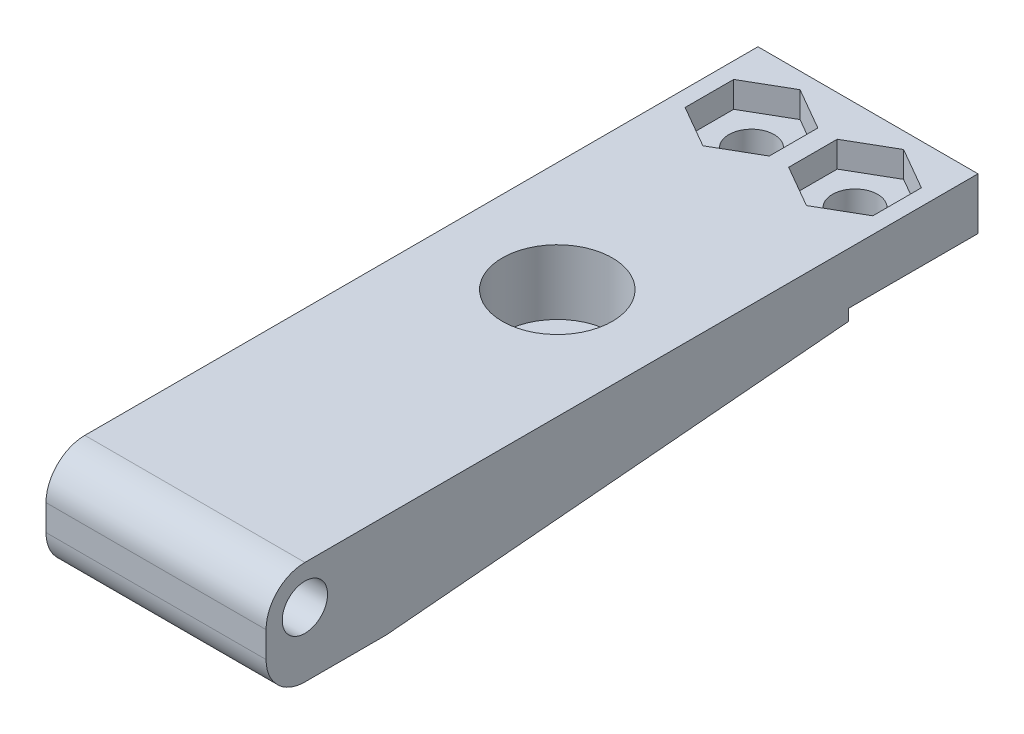
ISO-10303-21;
HEADER;
FILE_DESCRIPTION(('STEP AP214'),'2;1');
FILE_NAME('part.step','',(''),(''),'','','');
FILE_SCHEMA(('AUTOMOTIVE_DESIGN { 1 0 10303 214 1 1 1 1 }'));
ENDSEC;
DATA;
#1=APPLICATION_CONTEXT('core data for automotive mechanical design processes');
#2=APPLICATION_PROTOCOL_DEFINITION('international standard','automotive_design',2000,#1);
#3=PRODUCT_CONTEXT('',#1,'mechanical');
#4=PRODUCT('Part','Part','',(#3));
#5=PRODUCT_RELATED_PRODUCT_CATEGORY('part','',(#4));
#6=PRODUCT_DEFINITION_FORMATION('','',#4);
#7=PRODUCT_DEFINITION_CONTEXT('part definition',#1,'design');
#8=PRODUCT_DEFINITION('design','',#6,#7);
#9=PRODUCT_DEFINITION_SHAPE('','',#8);
#10=(LENGTH_UNIT() NAMED_UNIT(*) SI_UNIT(.MILLI.,.METRE.));
#11=(NAMED_UNIT(*) PLANE_ANGLE_UNIT() SI_UNIT($,.RADIAN.));
#12=(NAMED_UNIT(*) SI_UNIT($,.STERADIAN.) SOLID_ANGLE_UNIT());
#13=UNCERTAINTY_MEASURE_WITH_UNIT(LENGTH_MEASURE(1.E-05),#10,'distance_accuracy_value','');
#14=(GEOMETRIC_REPRESENTATION_CONTEXT(3) GLOBAL_UNCERTAINTY_ASSIGNED_CONTEXT((#13)) GLOBAL_UNIT_ASSIGNED_CONTEXT((#10,
#11,#12)) REPRESENTATION_CONTEXT('',''));
#15=CARTESIAN_POINT('',(0.,0.,0.));
#16=DIRECTION('',(0.,0.,1.));
#17=DIRECTION('',(1.,0.,0.));
#18=AXIS2_PLACEMENT_3D('',#15,#16,#17);
#19=CARTESIAN_POINT('',(4.,-5.,-47.));
#20=DIRECTION('',(0.,1.,0.));
#21=DIRECTION('',(0.,0.,1.));
#22=AXIS2_PLACEMENT_3D('',#19,#20,#21);
#23=CYLINDRICAL_SURFACE('',#22,1.75);
#24=CARTESIAN_POINT('',(4.,-1.,-47.));
#25=DIRECTION('',(0.,-1.,0.));
#26=DIRECTION('',(0.,0.,-1.));
#27=AXIS2_PLACEMENT_3D('',#24,#25,#26);
#28=CIRCLE('',#27,1.75);
#29=CARTESIAN_POINT('',(4.,-1.,-48.75));
#30=VERTEX_POINT('',#29);
#31=EDGE_CURVE('E237',#30,#30,#28,.T.);
#32=ORIENTED_EDGE('',*,*,#31,.T.);
#33=EDGE_LOOP('',(#32));
#34=FACE_BOUND('',#33,.T.);
#35=CARTESIAN_POINT('',(4.,1.,-47.));
#36=DIRECTION('',(0.,1.,0.));
#37=DIRECTION('',(0.,0.,1.));
#38=AXIS2_PLACEMENT_3D('',#35,#36,#37);
#39=CIRCLE('',#38,1.75);
#40=CARTESIAN_POINT('',(4.,1.,-45.25));
#41=VERTEX_POINT('',#40);
#42=EDGE_CURVE('E206',#41,#41,#39,.T.);
#43=ORIENTED_EDGE('',*,*,#42,.T.);
#44=EDGE_LOOP('',(#43));
#45=FACE_BOUND('',#44,.T.);
#46=ADVANCED_FACE('F41',(#34,#45),#23,.F.);
#47=CARTESIAN_POINT('',(-4.,-5.,-47.));
#48=DIRECTION('',(0.,1.,0.));
#49=DIRECTION('',(0.,0.,1.));
#50=AXIS2_PLACEMENT_3D('',#47,#48,#49);
#51=CYLINDRICAL_SURFACE('',#50,1.75);
#52=CARTESIAN_POINT('',(-4.,-1.,-47.));
#53=DIRECTION('',(0.,-1.,0.));
#54=DIRECTION('',(0.,0.,-1.));
#55=AXIS2_PLACEMENT_3D('',#52,#53,#54);
#56=CIRCLE('',#55,1.75);
#57=CARTESIAN_POINT('',(-4.,-1.,-48.75));
#58=VERTEX_POINT('',#57);
#59=EDGE_CURVE('E45',#58,#58,#56,.T.);
#60=ORIENTED_EDGE('',*,*,#59,.T.);
#61=EDGE_LOOP('',(#60));
#62=FACE_BOUND('',#61,.T.);
#63=CARTESIAN_POINT('',(-4.,1.,-47.));
#64=DIRECTION('',(0.,1.,0.));
#65=DIRECTION('',(0.,0.,1.));
#66=AXIS2_PLACEMENT_3D('',#63,#64,#65);
#67=CIRCLE('',#66,1.75);
#68=CARTESIAN_POINT('',(-4.,1.,-45.25));
#69=VERTEX_POINT('',#68);
#70=EDGE_CURVE('E245',#69,#69,#67,.T.);
#71=ORIENTED_EDGE('',*,*,#70,.T.);
#72=EDGE_LOOP('',(#71));
#73=FACE_BOUND('',#72,.T.);
#74=ADVANCED_FACE('F372',(#62,#73),#51,.F.);
#75=CARTESIAN_POINT('',(8.5,3.,0.));
#76=DIRECTION('',(0.,1.,0.));
#77=DIRECTION('',(0.,0.,1.));
#78=AXIS2_PLACEMENT_3D('',#75,#76,#77);
#79=PLANE('',#78);
#80=CARTESIAN_POINT('',(0.,3.,-28.));
#81=DIRECTION('',(0.,1.,0.));
#82=DIRECTION('',(0.,0.,1.));
#83=AXIS2_PLACEMENT_3D('',#80,#81,#82);
#84=CIRCLE('',#83,4.25);
#85=CARTESIAN_POINT('',(0.,3.,-23.75));
#86=VERTEX_POINT('',#85);
#87=EDGE_CURVE('E659',#86,#86,#84,.T.);
#88=ORIENTED_EDGE('',*,*,#87,.F.);
#89=EDGE_LOOP('',(#88));
#90=FACE_BOUND('',#89,.T.);
#91=DIRECTION('',(-0.86602540378444,0.,0.499999999999998));
#92=VECTOR('',#91,1.);
#93=CARTESIAN_POINT('',(-20.9765969889343,3.,-36.3325317547307));
#94=LINE('',#93,#92);
#95=CARTESIAN_POINT('',(4.00000000000001,3.,-50.7527767497326));
#96=VERTEX_POINT('',#95);
#97=CARTESIAN_POINT('',(0.749999999999983,3.,-48.8763883748663));
#98=VERTEX_POINT('',#97);
#99=EDGE_CURVE('E58',#96,#98,#94,.T.);
#100=ORIENTED_EDGE('',*,*,#99,.F.);
#101=DIRECTION('',(-0.866025403784438,0.,-0.5));
#102=VECTOR('',#101,1.);
#103=CARTESIAN_POINT('',(22.9765969889343,3.,-39.7966333698683));
#104=LINE('',#103,#102);
#105=CARTESIAN_POINT('',(7.25000000000001,3.,-48.8763883748663));
#106=VERTEX_POINT('',#105);
#107=EDGE_CURVE('E209',#106,#96,#104,.T.);
#108=ORIENTED_EDGE('',*,*,#107,.F.);
#109=DIRECTION('',(0.,0.,-1.));
#110=VECTOR('',#109,1.);
#111=CARTESIAN_POINT('',(7.25000000000001,3.,0.));
#112=LINE('',#111,#110);
#113=CARTESIAN_POINT('',(7.25000000000001,3.,-45.1236116251337));
#114=VERTEX_POINT('',#113);
#115=EDGE_CURVE('E230',#114,#106,#112,.T.);
#116=ORIENTED_EDGE('',*,*,#115,.F.);
#117=DIRECTION('',(0.866025403784439,0.,-0.5));
#118=VECTOR('',#117,1.);
#119=CARTESIAN_POINT('',(-17.7265969889343,3.,-30.7033666301317));
#120=LINE('',#119,#118);
#121=CARTESIAN_POINT('',(4.,3.,-43.2472232502674));
#122=VERTEX_POINT('',#121);
#123=EDGE_CURVE('E227',#122,#114,#120,.T.);
#124=ORIENTED_EDGE('',*,*,#123,.F.);
#125=DIRECTION('',(0.866025403784438,0.,0.500000000000001));
#126=VECTOR('',#125,1.);
#127=CARTESIAN_POINT('',(19.7265969889343,3.,-34.1674682452694));
#128=LINE('',#127,#126);
#129=CARTESIAN_POINT('',(0.749999999999983,3.,-45.1236116251337));
#130=VERTEX_POINT('',#129);
#131=EDGE_CURVE('E224',#130,#122,#128,.T.);
#132=ORIENTED_EDGE('',*,*,#131,.F.);
#133=DIRECTION('',(0.,0.,1.));
#134=VECTOR('',#133,1.);
#135=CARTESIAN_POINT('',(0.749999999999975,3.,0.));
#136=LINE('',#135,#134);
#137=EDGE_CURVE('E221',#98,#130,#136,.T.);
#138=ORIENTED_EDGE('',*,*,#137,.F.);
#139=EDGE_LOOP('',(#100,#108,#116,#124,#132,#138));
#140=FACE_BOUND('',#139,.T.);
#141=DIRECTION('',(0.866025403784438,0.,-0.500000000000001));
#142=VECTOR('',#141,1.);
#143=CARTESIAN_POINT('',(-19.7265969889343,3.,-34.1674682452694));
#144=LINE('',#143,#142);
#145=CARTESIAN_POINT('',(-4.,3.,-43.2472232502674));
#146=VERTEX_POINT('',#145);
#147=CARTESIAN_POINT('',(-0.749999999999994,3.,-45.1236116251337));
#148=VERTEX_POINT('',#147);
#149=EDGE_CURVE('E66',#146,#148,#144,.T.);
#150=ORIENTED_EDGE('',*,*,#149,.F.);
#151=DIRECTION('',(0.866025403784438,0.,0.5));
#152=VECTOR('',#151,1.);
#153=CARTESIAN_POINT('',(17.7265969889343,3.,-30.7033666301317));
#154=LINE('',#153,#152);
#155=CARTESIAN_POINT('',(-7.25000000000001,3.,-45.1236116251337));
#156=VERTEX_POINT('',#155);
#157=EDGE_CURVE('E249',#156,#146,#154,.T.);
#158=ORIENTED_EDGE('',*,*,#157,.F.);
#159=DIRECTION('',(0.,0.,1.));
#160=VECTOR('',#159,1.);
#161=CARTESIAN_POINT('',(-7.25000000000001,3.,0.));
#162=LINE('',#161,#160);
#163=CARTESIAN_POINT('',(-7.25000000000002,3.,-48.8763883748663));
#164=VERTEX_POINT('',#163);
#165=EDGE_CURVE('E279',#164,#156,#162,.T.);
#166=ORIENTED_EDGE('',*,*,#165,.F.);
#167=DIRECTION('',(-0.86602540378444,0.,0.499999999999998));
#168=VECTOR('',#167,1.);
#169=CARTESIAN_POINT('',(-22.9765969889342,3.,-39.7966333698684));
#170=LINE('',#169,#168);
#171=CARTESIAN_POINT('',(-4.,3.,-50.7527767497326));
#172=VERTEX_POINT('',#171);
#173=EDGE_CURVE('E276',#172,#164,#170,.T.);
#174=ORIENTED_EDGE('',*,*,#173,.F.);
#175=DIRECTION('',(-0.866025403784441,0.,-0.499999999999995));
#176=VECTOR('',#175,1.);
#177=CARTESIAN_POINT('',(20.9765969889342,3.,-36.3325317547308));
#178=LINE('',#177,#176);
#179=CARTESIAN_POINT('',(-0.749999999999994,3.,-48.8763883748663));
#180=VERTEX_POINT('',#179);
#181=EDGE_CURVE('E273',#180,#172,#178,.T.);
#182=ORIENTED_EDGE('',*,*,#181,.F.);
#183=DIRECTION('',(0.,0.,-1.));
#184=VECTOR('',#183,1.);
#185=CARTESIAN_POINT('',(-0.749999999999995,3.,0.));
#186=LINE('',#185,#184);
#187=EDGE_CURVE('E269',#148,#180,#186,.T.);
#188=ORIENTED_EDGE('',*,*,#187,.F.);
#189=EDGE_LOOP('',(#150,#158,#166,#174,#182,#188));
#190=FACE_BOUND('',#189,.T.);
#191=DIRECTION('',(0.,0.,-1.));
#192=VECTOR('',#191,1.);
#193=CARTESIAN_POINT('',(-8.5,3.,0.));
#194=LINE('',#193,#192);
#195=CARTESIAN_POINT('',(-8.5,3.,0.));
#196=VERTEX_POINT('',#195);
#197=CARTESIAN_POINT('',(-8.5,3.,-52.));
#198=VERTEX_POINT('',#197);
#199=EDGE_CURVE('E324',#196,#198,#194,.T.);
#200=ORIENTED_EDGE('',*,*,#199,.F.);
#201=DIRECTION('',(-1.,0.,0.));
#202=VECTOR('',#201,1.);
#203=CARTESIAN_POINT('',(8.5,3.,0.));
#204=LINE('',#203,#202);
#205=CARTESIAN_POINT('',(8.5,3.,0.));
#206=VERTEX_POINT('',#205);
#207=EDGE_CURVE('E359',#206,#196,#204,.T.);
#208=ORIENTED_EDGE('',*,*,#207,.F.);
#209=DIRECTION('',(0.,0.,-1.));
#210=VECTOR('',#209,1.);
#211=CARTESIAN_POINT('',(8.5,3.,0.));
#212=LINE('',#211,#210);
#213=CARTESIAN_POINT('',(8.5,3.,-52.));
#214=VERTEX_POINT('',#213);
#215=EDGE_CURVE('E297',#206,#214,#212,.T.);
#216=ORIENTED_EDGE('',*,*,#215,.T.);
#217=DIRECTION('',(-1.,0.,0.));
#218=VECTOR('',#217,1.);
#219=CARTESIAN_POINT('',(8.5,3.,-52.));
#220=LINE('',#219,#218);
#221=EDGE_CURVE('E320',#214,#198,#220,.T.);
#222=ORIENTED_EDGE('',*,*,#221,.T.);
#223=EDGE_LOOP('',(#200,#208,#216,#222));
#224=FACE_BOUND('',#223,.T.);
#225=ADVANCED_FACE('F419',(#90,#140,#190,#224),#79,.T.);
#226=CARTESIAN_POINT('',(8.5,0.,0.));
#227=DIRECTION('',(-1.,0.,0.));
#228=DIRECTION('',(0.,0.,1.));
#229=AXIS2_PLACEMENT_3D('',#226,#227,#228);
#230=CYLINDRICAL_SURFACE('',#229,3.);
#231=CARTESIAN_POINT('',(-8.5,0.,0.));
#232=DIRECTION('',(1.,0.,0.));
#233=DIRECTION('',(0.,0.,-1.));
#234=AXIS2_PLACEMENT_3D('',#231,#232,#233);
#235=CIRCLE('',#234,3.);
#236=CARTESIAN_POINT('',(-8.5,0.,3.));
#237=VERTEX_POINT('',#236);
#238=EDGE_CURVE('E327',#196,#237,#235,.T.);
#239=ORIENTED_EDGE('',*,*,#238,.T.);
#240=DIRECTION('',(-1.,0.,0.));
#241=VECTOR('',#240,1.);
#242=CARTESIAN_POINT('',(8.5,0.,3.));
#243=LINE('',#242,#241);
#244=CARTESIAN_POINT('',(8.5,0.,3.));
#245=VERTEX_POINT('',#244);
#246=EDGE_CURVE('E356',#245,#237,#243,.T.);
#247=ORIENTED_EDGE('',*,*,#246,.F.);
#248=CARTESIAN_POINT('',(8.5,0.,0.));
#249=DIRECTION('',(1.,0.,0.));
#250=DIRECTION('',(0.,0.,-1.));
#251=AXIS2_PLACEMENT_3D('',#248,#249,#250);
#252=CIRCLE('',#251,3.);
#253=EDGE_CURVE('E301',#206,#245,#252,.T.);
#254=ORIENTED_EDGE('',*,*,#253,.F.);
#255=ORIENTED_EDGE('',*,*,#207,.T.);
#256=EDGE_LOOP('',(#239,#247,#254,#255));
#257=FACE_BOUND('',#256,.T.);
#258=ADVANCED_FACE('F417',(#257),#230,.T.);
#259=CARTESIAN_POINT('',(8.5,0.,3.));
#260=DIRECTION('',(0.,0.,-1.));
#261=DIRECTION('',(0.,1.,0.));
#262=AXIS2_PLACEMENT_3D('',#259,#260,#261);
#263=PLANE('',#262);
#264=DIRECTION('',(0.,-1.,0.));
#265=VECTOR('',#264,1.);
#266=CARTESIAN_POINT('',(-8.5,0.,3.));
#267=LINE('',#266,#265);
#268=CARTESIAN_POINT('',(-8.5,-2.,3.));
#269=VERTEX_POINT('',#268);
#270=EDGE_CURVE('E330',#237,#269,#267,.T.);
#271=ORIENTED_EDGE('',*,*,#270,.T.);
#272=DIRECTION('',(-1.,0.,0.));
#273=VECTOR('',#272,1.);
#274=CARTESIAN_POINT('',(8.5,-2.,3.));
#275=LINE('',#274,#273);
#276=CARTESIAN_POINT('',(8.5,-2.,3.));
#277=VERTEX_POINT('',#276);
#278=EDGE_CURVE('E50',#269,#277,#275,.F.);
#279=ORIENTED_EDGE('',*,*,#278,.T.);
#280=DIRECTION('',(0.,-1.,0.));
#281=VECTOR('',#280,1.);
#282=CARTESIAN_POINT('',(8.5,0.,3.));
#283=LINE('',#282,#281);
#284=EDGE_CURVE('E304',#245,#277,#283,.T.);
#285=ORIENTED_EDGE('',*,*,#284,.F.);
#286=ORIENTED_EDGE('',*,*,#246,.T.);
#287=EDGE_LOOP('',(#271,#279,#285,#286));
#288=FACE_BOUND('',#287,.T.);
#289=ADVANCED_FACE('F413',(#288),#263,.F.);
#290=CARTESIAN_POINT('',(8.5,-5.,0.));
#291=DIRECTION('',(0.,1.,0.));
#292=DIRECTION('',(0.,0.,1.));
#293=AXIS2_PLACEMENT_3D('',#290,#291,#292);
#294=PLANE('',#293);
#295=DIRECTION('',(0.,0.,-1.));
#296=VECTOR('',#295,1.);
#297=CARTESIAN_POINT('',(8.5,-5.,0.));
#298=LINE('',#297,#296);
#299=CARTESIAN_POINT('',(8.5,-5.,0.));
#300=VERTEX_POINT('',#299);
#301=CARTESIAN_POINT('',(8.5,-5.,-6.27979078895471));
#302=VERTEX_POINT('',#301);
#303=EDGE_CURVE('E307',#300,#302,#298,.T.);
#304=ORIENTED_EDGE('',*,*,#303,.F.);
#305=DIRECTION('',(-1.,0.,0.));
#306=VECTOR('',#305,1.);
#307=CARTESIAN_POINT('',(8.5,-5.,0.));
#308=LINE('',#307,#306);
#309=CARTESIAN_POINT('',(-8.5,-5.,0.));
#310=VERTEX_POINT('',#309);
#311=EDGE_CURVE('E361',#300,#310,#308,.T.);
#312=ORIENTED_EDGE('',*,*,#311,.T.);
#313=DIRECTION('',(0.,0.,-1.));
#314=VECTOR('',#313,1.);
#315=CARTESIAN_POINT('',(-8.5,-5.,0.));
#316=LINE('',#315,#314);
#317=CARTESIAN_POINT('',(-8.5,-5.,-6.27979078895471));
#318=VERTEX_POINT('',#317);
#319=EDGE_CURVE('E333',#310,#318,#316,.T.);
#320=ORIENTED_EDGE('',*,*,#319,.T.);
#321=DIRECTION('',(-1.,0.,0.));
#322=VECTOR('',#321,1.);
#323=CARTESIAN_POINT('',(8.5,-5.,-6.27979078895471));
#324=LINE('',#323,#322);
#325=EDGE_CURVE('E353',#302,#318,#324,.T.);
#326=ORIENTED_EDGE('',*,*,#325,.F.);
#327=EDGE_LOOP('',(#304,#312,#320,#326));
#328=FACE_BOUND('',#327,.T.);
#329=ADVANCED_FACE('F407',(#328),#294,.F.);
#330=CARTESIAN_POINT('',(8.5,-5.5072564958463,-0.481822510516057));
#331=DIRECTION('',(0.,0.996194698091746,0.0871557427476583));
#332=DIRECTION('',(0.,-0.0871557427476583,0.996194698091746));
#333=AXIS2_PLACEMENT_3D('',#330,#331,#332);
#334=PLANE('',#333);
#335=DIRECTION('',(0.,0.0871557427476583,-0.996194698091746));
#336=VECTOR('',#335,1.);
#337=CARTESIAN_POINT('',(-8.5,-5.5072564958463,-0.481822510516057));
#338=LINE('',#337,#336);
#339=CARTESIAN_POINT('',(-8.5,-1.87488663525924,-42.));
#340=VERTEX_POINT('',#339);
#341=EDGE_CURVE('E335',#318,#340,#338,.T.);
#342=ORIENTED_EDGE('',*,*,#341,.T.);
#343=DIRECTION('',(-1.,0.,0.));
#344=VECTOR('',#343,1.);
#345=CARTESIAN_POINT('',(8.5,-1.87488663525924,-42.));
#346=LINE('',#345,#344);
#347=CARTESIAN_POINT('',(8.5,-1.87488663525924,-42.));
#348=VERTEX_POINT('',#347);
#349=EDGE_CURVE('E351',#348,#340,#346,.T.);
#350=ORIENTED_EDGE('',*,*,#349,.F.);
#351=DIRECTION('',(0.,0.0871557427476583,-0.996194698091746));
#352=VECTOR('',#351,1.);
#353=CARTESIAN_POINT('',(8.5,-5.5072564958463,-0.481822510516057));
#354=LINE('',#353,#352);
#355=EDGE_CURVE('E309',#302,#348,#354,.T.);
#356=ORIENTED_EDGE('',*,*,#355,.F.);
#357=ORIENTED_EDGE('',*,*,#325,.T.);
#358=EDGE_LOOP('',(#342,#350,#356,#357));
#359=FACE_BOUND('',#358,.T.);
#360=ADVANCED_FACE('F404',(#359),#334,.F.);
#361=CARTESIAN_POINT('',(8.5,0.,-42.));
#362=DIRECTION('',(0.,0.,-1.));
#363=DIRECTION('',(-1.,0.,0.));
#364=AXIS2_PLACEMENT_3D('',#361,#362,#363);
#365=PLANE('',#364);
#366=DIRECTION('',(0.,-1.,0.));
#367=VECTOR('',#366,1.);
#368=CARTESIAN_POINT('',(-8.5,0.,-42.));
#369=LINE('',#368,#367);
#370=CARTESIAN_POINT('',(-8.5,-1.,-42.));
#371=VERTEX_POINT('',#370);
#372=EDGE_CURVE('E338',#371,#340,#369,.T.);
#373=ORIENTED_EDGE('',*,*,#372,.F.);
#374=DIRECTION('',(-1.,0.,0.));
#375=VECTOR('',#374,1.);
#376=CARTESIAN_POINT('',(8.5,-1.,-42.));
#377=LINE('',#376,#375);
#378=CARTESIAN_POINT('',(8.5,-1.,-42.));
#379=VERTEX_POINT('',#378);
#380=EDGE_CURVE('E349',#379,#371,#377,.T.);
#381=ORIENTED_EDGE('',*,*,#380,.F.);
#382=DIRECTION('',(0.,-1.,0.));
#383=VECTOR('',#382,1.);
#384=CARTESIAN_POINT('',(8.5,0.,-42.));
#385=LINE('',#384,#383);
#386=EDGE_CURVE('E311',#379,#348,#385,.T.);
#387=ORIENTED_EDGE('',*,*,#386,.T.);
#388=ORIENTED_EDGE('',*,*,#349,.T.);
#389=EDGE_LOOP('',(#373,#381,#387,#388));
#390=FACE_BOUND('',#389,.T.);
#391=ADVANCED_FACE('F379',(#390),#365,.T.);
#392=CARTESIAN_POINT('',(8.5,-1.00000000000001,0.));
#393=DIRECTION('',(0.,-1.,0.));
#394=DIRECTION('',(0.,0.,-1.));
#395=AXIS2_PLACEMENT_3D('',#392,#393,#394);
#396=PLANE('',#395);
#397=ORIENTED_EDGE('',*,*,#59,.F.);
#398=EDGE_LOOP('',(#397));
#399=FACE_BOUND('',#398,.T.);
#400=ORIENTED_EDGE('',*,*,#31,.F.);
#401=EDGE_LOOP('',(#400));
#402=FACE_BOUND('',#401,.T.);
#403=DIRECTION('',(0.,0.,1.));
#404=VECTOR('',#403,1.);
#405=CARTESIAN_POINT('',(-8.5,-1.00000000000001,0.));
#406=LINE('',#405,#404);
#407=CARTESIAN_POINT('',(-8.5,-1.,-52.));
#408=VERTEX_POINT('',#407);
#409=EDGE_CURVE('E341',#408,#371,#406,.T.);
#410=ORIENTED_EDGE('',*,*,#409,.F.);
#411=DIRECTION('',(-1.,0.,0.));
#412=VECTOR('',#411,1.);
#413=CARTESIAN_POINT('',(8.5,-1.,-52.));
#414=LINE('',#413,#412);
#415=CARTESIAN_POINT('',(8.5,-1.,-52.));
#416=VERTEX_POINT('',#415);
#417=EDGE_CURVE('E347',#416,#408,#414,.T.);
#418=ORIENTED_EDGE('',*,*,#417,.F.);
#419=DIRECTION('',(0.,0.,1.));
#420=VECTOR('',#419,1.);
#421=CARTESIAN_POINT('',(8.5,-1.00000000000001,0.));
#422=LINE('',#421,#420);
#423=EDGE_CURVE('E314',#416,#379,#422,.T.);
#424=ORIENTED_EDGE('',*,*,#423,.T.);
#425=ORIENTED_EDGE('',*,*,#380,.T.);
#426=EDGE_LOOP('',(#410,#418,#424,#425));
#427=FACE_BOUND('',#426,.T.);
#428=ADVANCED_FACE('F375',(#399,#402,#427),#396,.T.);
#429=CARTESIAN_POINT('',(8.5,0.,0.));
#430=DIRECTION('',(-1.,0.,0.));
#431=DIRECTION('',(0.,0.,1.));
#432=AXIS2_PLACEMENT_3D('',#429,#430,#431);
#433=CYLINDRICAL_SURFACE('',#432,1.75);
#434=CARTESIAN_POINT('',(8.5,0.,0.));
#435=DIRECTION('',(1.,0.,0.));
#436=DIRECTION('',(0.,0.,-1.));
#437=AXIS2_PLACEMENT_3D('',#434,#435,#436);
#438=CIRCLE('',#437,1.75);
#439=CARTESIAN_POINT('',(8.5,0.,-1.75));
#440=VERTEX_POINT('',#439);
#441=EDGE_CURVE('E294',#440,#440,#438,.T.);
#442=ORIENTED_EDGE('',*,*,#441,.T.);
#443=EDGE_LOOP('',(#442));
#444=FACE_BOUND('',#443,.T.);
#445=CARTESIAN_POINT('',(-8.5,0.,0.));
#446=DIRECTION('',(1.,0.,0.));
#447=DIRECTION('',(0.,0.,-1.));
#448=AXIS2_PLACEMENT_3D('',#445,#446,#447);
#449=CIRCLE('',#448,1.75);
#450=CARTESIAN_POINT('',(-8.5,0.,-1.75));
#451=VERTEX_POINT('',#450);
#452=EDGE_CURVE('E321',#451,#451,#449,.T.);
#453=ORIENTED_EDGE('',*,*,#452,.F.);
#454=EDGE_LOOP('',(#453));
#455=FACE_BOUND('',#454,.T.);
#456=ADVANCED_FACE('F378',(#444,#455),#433,.F.);
#457=CARTESIAN_POINT('',(8.5,0.,-52.));
#458=DIRECTION('',(0.,0.,-1.));
#459=DIRECTION('',(-1.,0.,0.));
#460=AXIS2_PLACEMENT_3D('',#457,#458,#459);
#461=PLANE('',#460);
#462=DIRECTION('',(0.,-1.,0.));
#463=VECTOR('',#462,1.);
#464=CARTESIAN_POINT('',(-8.5,0.,-52.));
#465=LINE('',#464,#463);
#466=EDGE_CURVE('E298',#198,#408,#465,.T.);
#467=ORIENTED_EDGE('',*,*,#466,.F.);
#468=ORIENTED_EDGE('',*,*,#221,.F.);
#469=DIRECTION('',(0.,-1.,0.));
#470=VECTOR('',#469,1.);
#471=CARTESIAN_POINT('',(8.5,0.,-52.));
#472=LINE('',#471,#470);
#473=EDGE_CURVE('E317',#214,#416,#472,.T.);
#474=ORIENTED_EDGE('',*,*,#473,.T.);
#475=ORIENTED_EDGE('',*,*,#417,.T.);
#476=EDGE_LOOP('',(#467,#468,#474,#475));
#477=FACE_BOUND('',#476,.T.);
#478=ADVANCED_FACE('F392',(#477),#461,.T.);
#479=CARTESIAN_POINT('',(8.5,0.,0.));
#480=DIRECTION('',(1.,0.,0.));
#481=DIRECTION('',(0.,0.,-1.));
#482=AXIS2_PLACEMENT_3D('',#479,#480,#481);
#483=PLANE('',#482);
#484=ORIENTED_EDGE('',*,*,#441,.F.);
#485=EDGE_LOOP('',(#484));
#486=FACE_BOUND('',#485,.T.);
#487=ORIENTED_EDGE('',*,*,#284,.T.);
#488=CARTESIAN_POINT('',(8.5,-2.,0.));
#489=DIRECTION('',(1.,0.,0.));
#490=DIRECTION('',(0.,0.,-1.));
#491=AXIS2_PLACEMENT_3D('',#488,#489,#490);
#492=CIRCLE('',#491,3.);
#493=EDGE_CURVE('E11',#277,#300,#492,.T.);
#494=ORIENTED_EDGE('',*,*,#493,.T.);
#495=ORIENTED_EDGE('',*,*,#303,.T.);
#496=ORIENTED_EDGE('',*,*,#355,.T.);
#497=ORIENTED_EDGE('',*,*,#386,.F.);
#498=ORIENTED_EDGE('',*,*,#423,.F.);
#499=ORIENTED_EDGE('',*,*,#473,.F.);
#500=ORIENTED_EDGE('',*,*,#215,.F.);
#501=ORIENTED_EDGE('',*,*,#253,.T.);
#502=EDGE_LOOP('',(#487,#494,#495,#496,#497,#498,#499,#500,#501));
#503=FACE_BOUND('',#502,.T.);
#504=ADVANCED_FACE('F396',(#486,#503),#483,.T.);
#505=CARTESIAN_POINT('',(-8.5,0.,0.));
#506=DIRECTION('',(1.,0.,0.));
#507=DIRECTION('',(0.,0.,-1.));
#508=AXIS2_PLACEMENT_3D('',#505,#506,#507);
#509=PLANE('',#508);
#510=ORIENTED_EDGE('',*,*,#452,.T.);
#511=EDGE_LOOP('',(#510));
#512=FACE_BOUND('',#511,.T.);
#513=ORIENTED_EDGE('',*,*,#319,.F.);
#514=CARTESIAN_POINT('',(-8.5,-2.,0.));
#515=DIRECTION('',(1.,0.,0.));
#516=DIRECTION('',(0.,0.,-1.));
#517=AXIS2_PLACEMENT_3D('',#514,#515,#516);
#518=CIRCLE('',#517,3.);
#519=EDGE_CURVE('E364',#310,#269,#518,.F.);
#520=ORIENTED_EDGE('',*,*,#519,.T.);
#521=ORIENTED_EDGE('',*,*,#270,.F.);
#522=ORIENTED_EDGE('',*,*,#238,.F.);
#523=ORIENTED_EDGE('',*,*,#199,.T.);
#524=ORIENTED_EDGE('',*,*,#466,.T.);
#525=ORIENTED_EDGE('',*,*,#409,.T.);
#526=ORIENTED_EDGE('',*,*,#372,.T.);
#527=ORIENTED_EDGE('',*,*,#341,.F.);
#528=EDGE_LOOP('',(#513,#520,#521,#522,#523,#524,#525,#526,#527));
#529=FACE_BOUND('',#528,.T.);
#530=ADVANCED_FACE('F388',(#512,#529),#509,.F.);
#531=CARTESIAN_POINT('',(8.5,-2.,0.));
#532=DIRECTION('',(-1.,0.,0.));
#533=DIRECTION('',(0.,0.,1.));
#534=AXIS2_PLACEMENT_3D('',#531,#532,#533);
#535=CYLINDRICAL_SURFACE('',#534,3.);
#536=ORIENTED_EDGE('',*,*,#493,.F.);
#537=ORIENTED_EDGE('',*,*,#278,.F.);
#538=ORIENTED_EDGE('',*,*,#519,.F.);
#539=ORIENTED_EDGE('',*,*,#311,.F.);
#540=EDGE_LOOP('',(#536,#537,#538,#539));
#541=FACE_BOUND('',#540,.T.);
#542=ADVANCED_FACE('F43',(#541),#535,.T.);
#543=CARTESIAN_POINT('',(-19.7265969889343,1.,-34.1674682452694));
#544=DIRECTION('',(0.500000000000001,0.,0.866025403784438));
#545=DIRECTION('',(0.866025403784438,0.,-0.500000000000001));
#546=AXIS2_PLACEMENT_3D('',#543,#544,#545);
#547=PLANE('',#546);
#548=ORIENTED_EDGE('',*,*,#149,.T.);
#549=DIRECTION('',(0.,1.,0.));
#550=VECTOR('',#549,1.);
#551=CARTESIAN_POINT('',(-0.749999999999994,1.,-45.1236116251337));
#552=LINE('',#551,#550);
#553=CARTESIAN_POINT('',(-0.749999999999994,1.,-45.1236116251337));
#554=VERTEX_POINT('',#553);
#555=EDGE_CURVE('E267',#554,#148,#552,.T.);
#556=ORIENTED_EDGE('',*,*,#555,.F.);
#557=DIRECTION('',(0.866025403784438,0.,-0.500000000000001));
#558=VECTOR('',#557,1.);
#559=CARTESIAN_POINT('',(-19.7265969889343,1.,-34.1674682452694));
#560=LINE('',#559,#558);
#561=CARTESIAN_POINT('',(-4.,1.,-43.2472232502674));
#562=VERTEX_POINT('',#561);
#563=EDGE_CURVE('E248',#562,#554,#560,.T.);
#564=ORIENTED_EDGE('',*,*,#563,.F.);
#565=DIRECTION('',(0.,1.,0.));
#566=VECTOR('',#565,1.);
#567=CARTESIAN_POINT('',(-4.,1.,-43.2472232502674));
#568=LINE('',#567,#566);
#569=EDGE_CURVE('E222',#562,#146,#568,.T.);
#570=ORIENTED_EDGE('',*,*,#569,.T.);
#571=EDGE_LOOP('',(#548,#556,#564,#570));
#572=FACE_BOUND('',#571,.T.);
#573=ADVANCED_FACE('F483',(#572),#547,.F.);
#574=CARTESIAN_POINT('',(17.7265969889343,1.,-30.7033666301317));
#575=DIRECTION('',(-0.5,0.,0.866025403784438));
#576=DIRECTION('',(0.866025403784438,0.,0.5));
#577=AXIS2_PLACEMENT_3D('',#574,#575,#576);
#578=PLANE('',#577);
#579=ORIENTED_EDGE('',*,*,#157,.T.);
#580=ORIENTED_EDGE('',*,*,#569,.F.);
#581=DIRECTION('',(0.866025403784438,0.,0.5));
#582=VECTOR('',#581,1.);
#583=CARTESIAN_POINT('',(17.7265969889343,1.,-30.7033666301317));
#584=LINE('',#583,#582);
#585=CARTESIAN_POINT('',(-7.25000000000001,1.,-45.1236116251337));
#586=VERTEX_POINT('',#585);
#587=EDGE_CURVE('E264',#586,#562,#584,.T.);
#588=ORIENTED_EDGE('',*,*,#587,.F.);
#589=DIRECTION('',(0.,1.,0.));
#590=VECTOR('',#589,1.);
#591=CARTESIAN_POINT('',(-7.25000000000001,1.,-45.1236116251337));
#592=LINE('',#591,#590);
#593=EDGE_CURVE('E285',#586,#156,#592,.T.);
#594=ORIENTED_EDGE('',*,*,#593,.T.);
#595=EDGE_LOOP('',(#579,#580,#588,#594));
#596=FACE_BOUND('',#595,.T.);
#597=ADVANCED_FACE('F526',(#596),#578,.F.);
#598=CARTESIAN_POINT('',(-7.25000000000001,1.,0.));
#599=DIRECTION('',(-1.,0.,0.));
#600=DIRECTION('',(0.,0.,1.));
#601=AXIS2_PLACEMENT_3D('',#598,#599,#600);
#602=PLANE('',#601);
#603=ORIENTED_EDGE('',*,*,#165,.T.);
#604=ORIENTED_EDGE('',*,*,#593,.F.);
#605=DIRECTION('',(0.,0.,1.));
#606=VECTOR('',#605,1.);
#607=CARTESIAN_POINT('',(-7.25000000000001,1.,0.));
#608=LINE('',#607,#606);
#609=CARTESIAN_POINT('',(-7.25000000000002,1.,-48.8763883748663));
#610=VERTEX_POINT('',#609);
#611=EDGE_CURVE('E261',#610,#586,#608,.T.);
#612=ORIENTED_EDGE('',*,*,#611,.F.);
#613=DIRECTION('',(0.,1.,0.));
#614=VECTOR('',#613,1.);
#615=CARTESIAN_POINT('',(-7.25000000000002,1.,-48.8763883748663));
#616=LINE('',#615,#614);
#617=EDGE_CURVE('E287',#610,#164,#616,.T.);
#618=ORIENTED_EDGE('',*,*,#617,.T.);
#619=EDGE_LOOP('',(#603,#604,#612,#618));
#620=FACE_BOUND('',#619,.T.);
#621=ADVANCED_FACE('F533',(#620),#602,.F.);
#622=CARTESIAN_POINT('',(-22.9765969889342,1.,-39.7966333698684));
#623=DIRECTION('',(-0.499999999999998,0.,-0.86602540378444));
#624=DIRECTION('',(-0.86602540378444,0.,0.499999999999998));
#625=AXIS2_PLACEMENT_3D('',#622,#623,#624);
#626=PLANE('',#625);
#627=ORIENTED_EDGE('',*,*,#173,.T.);
#628=ORIENTED_EDGE('',*,*,#617,.F.);
#629=DIRECTION('',(-0.86602540378444,0.,0.499999999999998));
#630=VECTOR('',#629,1.);
#631=CARTESIAN_POINT('',(-22.9765969889342,1.,-39.7966333698684));
#632=LINE('',#631,#630);
#633=CARTESIAN_POINT('',(-4.,1.,-50.7527767497326));
#634=VERTEX_POINT('',#633);
#635=EDGE_CURVE('E258',#634,#610,#632,.T.);
#636=ORIENTED_EDGE('',*,*,#635,.F.);
#637=DIRECTION('',(0.,1.,0.));
#638=VECTOR('',#637,1.);
#639=CARTESIAN_POINT('',(-4.,1.,-50.7527767497326));
#640=LINE('',#639,#638);
#641=EDGE_CURVE('E289',#634,#172,#640,.T.);
#642=ORIENTED_EDGE('',*,*,#641,.T.);
#643=EDGE_LOOP('',(#627,#628,#636,#642));
#644=FACE_BOUND('',#643,.T.);
#645=ADVANCED_FACE('F542',(#644),#626,.F.);
#646=CARTESIAN_POINT('',(20.9765969889342,1.,-36.3325317547308));
#647=DIRECTION('',(0.499999999999995,0.,-0.866025403784441));
#648=DIRECTION('',(-0.866025403784441,0.,-0.499999999999995));
#649=AXIS2_PLACEMENT_3D('',#646,#647,#648);
#650=PLANE('',#649);
#651=ORIENTED_EDGE('',*,*,#181,.T.);
#652=ORIENTED_EDGE('',*,*,#641,.F.);
#653=DIRECTION('',(-0.866025403784441,0.,-0.499999999999995));
#654=VECTOR('',#653,1.);
#655=CARTESIAN_POINT('',(20.9765969889342,1.,-36.3325317547308));
#656=LINE('',#655,#654);
#657=CARTESIAN_POINT('',(-0.749999999999994,1.,-48.8763883748663));
#658=VERTEX_POINT('',#657);
#659=EDGE_CURVE('E255',#658,#634,#656,.T.);
#660=ORIENTED_EDGE('',*,*,#659,.F.);
#661=DIRECTION('',(0.,1.,0.));
#662=VECTOR('',#661,1.);
#663=CARTESIAN_POINT('',(-0.749999999999994,1.,-48.8763883748663));
#664=LINE('',#663,#662);
#665=EDGE_CURVE('E291',#658,#180,#664,.T.);
#666=ORIENTED_EDGE('',*,*,#665,.T.);
#667=EDGE_LOOP('',(#651,#652,#660,#666));
#668=FACE_BOUND('',#667,.T.);
#669=ADVANCED_FACE('F551',(#668),#650,.F.);
#670=CARTESIAN_POINT('',(-0.749999999999995,1.,0.));
#671=DIRECTION('',(1.,0.,0.));
#672=DIRECTION('',(0.,0.,-1.));
#673=AXIS2_PLACEMENT_3D('',#670,#671,#672);
#674=PLANE('',#673);
#675=ORIENTED_EDGE('',*,*,#187,.T.);
#676=ORIENTED_EDGE('',*,*,#665,.F.);
#677=DIRECTION('',(0.,0.,-1.));
#678=VECTOR('',#677,1.);
#679=CARTESIAN_POINT('',(-0.749999999999995,1.,0.));
#680=LINE('',#679,#678);
#681=EDGE_CURVE('E252',#554,#658,#680,.T.);
#682=ORIENTED_EDGE('',*,*,#681,.F.);
#683=ORIENTED_EDGE('',*,*,#555,.T.);
#684=EDGE_LOOP('',(#675,#676,#682,#683));
#685=FACE_BOUND('',#684,.T.);
#686=ADVANCED_FACE('F560',(#685),#674,.F.);
#687=CARTESIAN_POINT('',(0.,1.,0.));
#688=DIRECTION('',(0.,1.,0.));
#689=DIRECTION('',(0.,0.,1.));
#690=AXIS2_PLACEMENT_3D('',#687,#688,#689);
#691=PLANE('',#690);
#692=ORIENTED_EDGE('',*,*,#70,.F.);
#693=EDGE_LOOP('',(#692));
#694=FACE_BOUND('',#693,.T.);
#695=ORIENTED_EDGE('',*,*,#563,.T.);
#696=ORIENTED_EDGE('',*,*,#681,.T.);
#697=ORIENTED_EDGE('',*,*,#659,.T.);
#698=ORIENTED_EDGE('',*,*,#635,.T.);
#699=ORIENTED_EDGE('',*,*,#611,.T.);
#700=ORIENTED_EDGE('',*,*,#587,.T.);
#701=EDGE_LOOP('',(#695,#696,#697,#698,#699,#700));
#702=FACE_BOUND('',#701,.T.);
#703=ADVANCED_FACE('F569',(#694,#702),#691,.T.);
#704=CARTESIAN_POINT('',(-20.9765969889343,1.,-36.3325317547307));
#705=DIRECTION('',(-0.499999999999998,0.,-0.86602540378444));
#706=DIRECTION('',(-0.86602540378444,0.,0.499999999999998));
#707=AXIS2_PLACEMENT_3D('',#704,#705,#706);
#708=PLANE('',#707);
#709=ORIENTED_EDGE('',*,*,#99,.T.);
#710=DIRECTION('',(0.,1.,0.));
#711=VECTOR('',#710,1.);
#712=CARTESIAN_POINT('',(0.749999999999983,1.,-48.8763883748663));
#713=LINE('',#712,#711);
#714=CARTESIAN_POINT('',(0.749999999999983,1.,-48.8763883748663));
#715=VERTEX_POINT('',#714);
#716=EDGE_CURVE('E183',#715,#98,#713,.T.);
#717=ORIENTED_EDGE('',*,*,#716,.F.);
#718=DIRECTION('',(-0.86602540378444,0.,0.499999999999998));
#719=VECTOR('',#718,1.);
#720=CARTESIAN_POINT('',(-20.9765969889343,1.,-36.3325317547307));
#721=LINE('',#720,#719);
#722=CARTESIAN_POINT('',(4.00000000000001,1.,-50.7527767497326));
#723=VERTEX_POINT('',#722);
#724=EDGE_CURVE('E187',#723,#715,#721,.T.);
#725=ORIENTED_EDGE('',*,*,#724,.F.);
#726=DIRECTION('',(0.,1.,0.));
#727=VECTOR('',#726,1.);
#728=CARTESIAN_POINT('',(4.00000000000001,1.,-50.7527767497326));
#729=LINE('',#728,#727);
#730=EDGE_CURVE('E235',#723,#96,#729,.T.);
#731=ORIENTED_EDGE('',*,*,#730,.T.);
#732=EDGE_LOOP('',(#709,#717,#725,#731));
#733=FACE_BOUND('',#732,.T.);
#734=ADVANCED_FACE('F185',(#733),#708,.F.);
#735=CARTESIAN_POINT('',(22.9765969889343,1.,-39.7966333698683));
#736=DIRECTION('',(0.5,0.,-0.866025403784438));
#737=DIRECTION('',(-0.866025403784438,0.,-0.5));
#738=AXIS2_PLACEMENT_3D('',#735,#736,#737);
#739=PLANE('',#738);
#740=ORIENTED_EDGE('',*,*,#107,.T.);
#741=ORIENTED_EDGE('',*,*,#730,.F.);
#742=DIRECTION('',(-0.866025403784438,0.,-0.5));
#743=VECTOR('',#742,1.);
#744=CARTESIAN_POINT('',(22.9765969889343,1.,-39.7966333698683));
#745=LINE('',#744,#743);
#746=CARTESIAN_POINT('',(7.25000000000001,1.,-48.8763883748663));
#747=VERTEX_POINT('',#746);
#748=EDGE_CURVE('E193',#747,#723,#745,.T.);
#749=ORIENTED_EDGE('',*,*,#748,.F.);
#750=DIRECTION('',(0.,1.,0.));
#751=VECTOR('',#750,1.);
#752=CARTESIAN_POINT('',(7.25000000000001,1.,-48.8763883748663));
#753=LINE('',#752,#751);
#754=EDGE_CURVE('E238',#747,#106,#753,.T.);
#755=ORIENTED_EDGE('',*,*,#754,.T.);
#756=EDGE_LOOP('',(#740,#741,#749,#755));
#757=FACE_BOUND('',#756,.T.);
#758=ADVANCED_FACE('F586',(#757),#739,.F.);
#759=CARTESIAN_POINT('',(7.25000000000001,1.,0.));
#760=DIRECTION('',(1.,0.,0.));
#761=DIRECTION('',(0.,0.,-1.));
#762=AXIS2_PLACEMENT_3D('',#759,#760,#761);
#763=PLANE('',#762);
#764=ORIENTED_EDGE('',*,*,#115,.T.);
#765=ORIENTED_EDGE('',*,*,#754,.F.);
#766=DIRECTION('',(0.,0.,-1.));
#767=VECTOR('',#766,1.);
#768=CARTESIAN_POINT('',(7.25000000000001,1.,0.));
#769=LINE('',#768,#767);
#770=CARTESIAN_POINT('',(7.25000000000001,1.,-45.1236116251337));
#771=VERTEX_POINT('',#770);
#772=EDGE_CURVE('E217',#771,#747,#769,.T.);
#773=ORIENTED_EDGE('',*,*,#772,.F.);
#774=DIRECTION('',(0.,1.,0.));
#775=VECTOR('',#774,1.);
#776=CARTESIAN_POINT('',(7.25000000000001,1.,-45.1236116251337));
#777=LINE('',#776,#775);
#778=EDGE_CURVE('E240',#771,#114,#777,.T.);
#779=ORIENTED_EDGE('',*,*,#778,.T.);
#780=EDGE_LOOP('',(#764,#765,#773,#779));
#781=FACE_BOUND('',#780,.T.);
#782=ADVANCED_FACE('F594',(#781),#763,.F.);
#783=CARTESIAN_POINT('',(-17.7265969889343,1.,-30.7033666301317));
#784=DIRECTION('',(0.5,0.,0.866025403784439));
#785=DIRECTION('',(0.866025403784439,0.,-0.5));
#786=AXIS2_PLACEMENT_3D('',#783,#784,#785);
#787=PLANE('',#786);
#788=ORIENTED_EDGE('',*,*,#123,.T.);
#789=ORIENTED_EDGE('',*,*,#778,.F.);
#790=DIRECTION('',(0.866025403784439,0.,-0.5));
#791=VECTOR('',#790,1.);
#792=CARTESIAN_POINT('',(-17.7265969889343,1.,-30.7033666301317));
#793=LINE('',#792,#791);
#794=CARTESIAN_POINT('',(4.,1.,-43.2472232502674));
#795=VERTEX_POINT('',#794);
#796=EDGE_CURVE('E214',#795,#771,#793,.T.);
#797=ORIENTED_EDGE('',*,*,#796,.F.);
#798=DIRECTION('',(0.,1.,0.));
#799=VECTOR('',#798,1.);
#800=CARTESIAN_POINT('',(4.,1.,-43.2472232502674));
#801=LINE('',#800,#799);
#802=EDGE_CURVE('E242',#795,#122,#801,.T.);
#803=ORIENTED_EDGE('',*,*,#802,.T.);
#804=EDGE_LOOP('',(#788,#789,#797,#803));
#805=FACE_BOUND('',#804,.T.);
#806=ADVANCED_FACE('F603',(#805),#787,.F.);
#807=CARTESIAN_POINT('',(19.7265969889343,1.,-34.1674682452694));
#808=DIRECTION('',(-0.500000000000001,0.,0.866025403784438));
#809=DIRECTION('',(0.866025403784438,0.,0.500000000000001));
#810=AXIS2_PLACEMENT_3D('',#807,#808,#809);
#811=PLANE('',#810);
#812=ORIENTED_EDGE('',*,*,#131,.T.);
#813=ORIENTED_EDGE('',*,*,#802,.F.);
#814=DIRECTION('',(0.866025403784438,0.,0.500000000000001));
#815=VECTOR('',#814,1.);
#816=CARTESIAN_POINT('',(19.7265969889343,1.,-34.1674682452694));
#817=LINE('',#816,#815);
#818=CARTESIAN_POINT('',(0.749999999999983,1.,-45.1236116251337));
#819=VERTEX_POINT('',#818);
#820=EDGE_CURVE('E201',#819,#795,#817,.T.);
#821=ORIENTED_EDGE('',*,*,#820,.F.);
#822=DIRECTION('',(0.,1.,0.));
#823=VECTOR('',#822,1.);
#824=CARTESIAN_POINT('',(0.749999999999983,1.,-45.1236116251337));
#825=LINE('',#824,#823);
#826=EDGE_CURVE('E192',#819,#130,#825,.T.);
#827=ORIENTED_EDGE('',*,*,#826,.T.);
#828=EDGE_LOOP('',(#812,#813,#821,#827));
#829=FACE_BOUND('',#828,.T.);
#830=ADVANCED_FACE('F612',(#829),#811,.F.);
#831=CARTESIAN_POINT('',(0.749999999999975,1.,0.));
#832=DIRECTION('',(-1.,0.,0.));
#833=DIRECTION('',(0.,0.,1.));
#834=AXIS2_PLACEMENT_3D('',#831,#832,#833);
#835=PLANE('',#834);
#836=ORIENTED_EDGE('',*,*,#137,.T.);
#837=ORIENTED_EDGE('',*,*,#826,.F.);
#838=DIRECTION('',(0.,0.,1.));
#839=VECTOR('',#838,1.);
#840=CARTESIAN_POINT('',(0.749999999999975,1.,0.));
#841=LINE('',#840,#839);
#842=EDGE_CURVE('E196',#715,#819,#841,.T.);
#843=ORIENTED_EDGE('',*,*,#842,.F.);
#844=ORIENTED_EDGE('',*,*,#716,.T.);
#845=EDGE_LOOP('',(#836,#837,#843,#844));
#846=FACE_BOUND('',#845,.T.);
#847=ADVANCED_FACE('F197',(#846),#835,.F.);
#848=CARTESIAN_POINT('',(0.,1.,0.));
#849=DIRECTION('',(0.,1.,0.));
#850=DIRECTION('',(0.,0.,1.));
#851=AXIS2_PLACEMENT_3D('',#848,#849,#850);
#852=PLANE('',#851);
#853=ORIENTED_EDGE('',*,*,#42,.F.);
#854=EDGE_LOOP('',(#853));
#855=FACE_BOUND('',#854,.T.);
#856=ORIENTED_EDGE('',*,*,#724,.T.);
#857=ORIENTED_EDGE('',*,*,#842,.T.);
#858=ORIENTED_EDGE('',*,*,#820,.T.);
#859=ORIENTED_EDGE('',*,*,#796,.T.);
#860=ORIENTED_EDGE('',*,*,#772,.T.);
#861=ORIENTED_EDGE('',*,*,#748,.T.);
#862=EDGE_LOOP('',(#856,#857,#858,#859,#860,#861));
#863=FACE_BOUND('',#862,.T.);
#864=ADVANCED_FACE('F203',(#855,#863),#852,.T.);
#865=CARTESIAN_POINT('',(0.,-2.,-28.));
#866=DIRECTION('',(0.,1.,0.));
#867=DIRECTION('',(0.,0.,1.));
#868=AXIS2_PLACEMENT_3D('',#865,#866,#867);
#869=CYLINDRICAL_SURFACE('',#868,4.25);
#870=CARTESIAN_POINT('',(0.,-2.,-28.));
#871=DIRECTION('',(0.,1.,0.));
#872=DIRECTION('',(0.,0.,1.));
#873=AXIS2_PLACEMENT_3D('',#870,#871,#872);
#874=CIRCLE('',#873,4.25);
#875=CARTESIAN_POINT('',(0.,-2.,-23.75));
#876=VERTEX_POINT('',#875);
#877=EDGE_CURVE('E270',#876,#876,#874,.T.);
#878=ORIENTED_EDGE('',*,*,#877,.F.);
#879=EDGE_LOOP('',(#878));
#880=FACE_BOUND('',#879,.T.);
#881=ORIENTED_EDGE('',*,*,#87,.T.);
#882=EDGE_LOOP('',(#881));
#883=FACE_BOUND('',#882,.T.);
#884=ADVANCED_FACE('F635',(#880,#883),#869,.F.);
#885=CARTESIAN_POINT('',(0.,-2.,-28.));
#886=DIRECTION('',(0.,1.,0.));
#887=DIRECTION('',(0.,0.,1.));
#888=AXIS2_PLACEMENT_3D('',#885,#886,#887);
#889=PLANE('',#888);
#890=ORIENTED_EDGE('',*,*,#877,.T.);
#891=EDGE_LOOP('',(#890));
#892=FACE_BOUND('',#891,.T.);
#893=ADVANCED_FACE('F643',(#892),#889,.T.);
#894=CLOSED_SHELL('',(#46,#74,#225,#258,#289,#329,#360,#391,#428,#456,#478,#504,#530,#542,#573,
#597,#621,#645,#669,#686,#703,#734,#758,#782,#806,#830,#847,#864,#884,#893));
#895=MANIFOLD_SOLID_BREP('B2',#894);
#896=ADVANCED_BREP_SHAPE_REPRESENTATION('',(#18,#895),#14);
#897=SHAPE_DEFINITION_REPRESENTATION(#9,#896);
ENDSEC;
END-ISO-10303-21;
